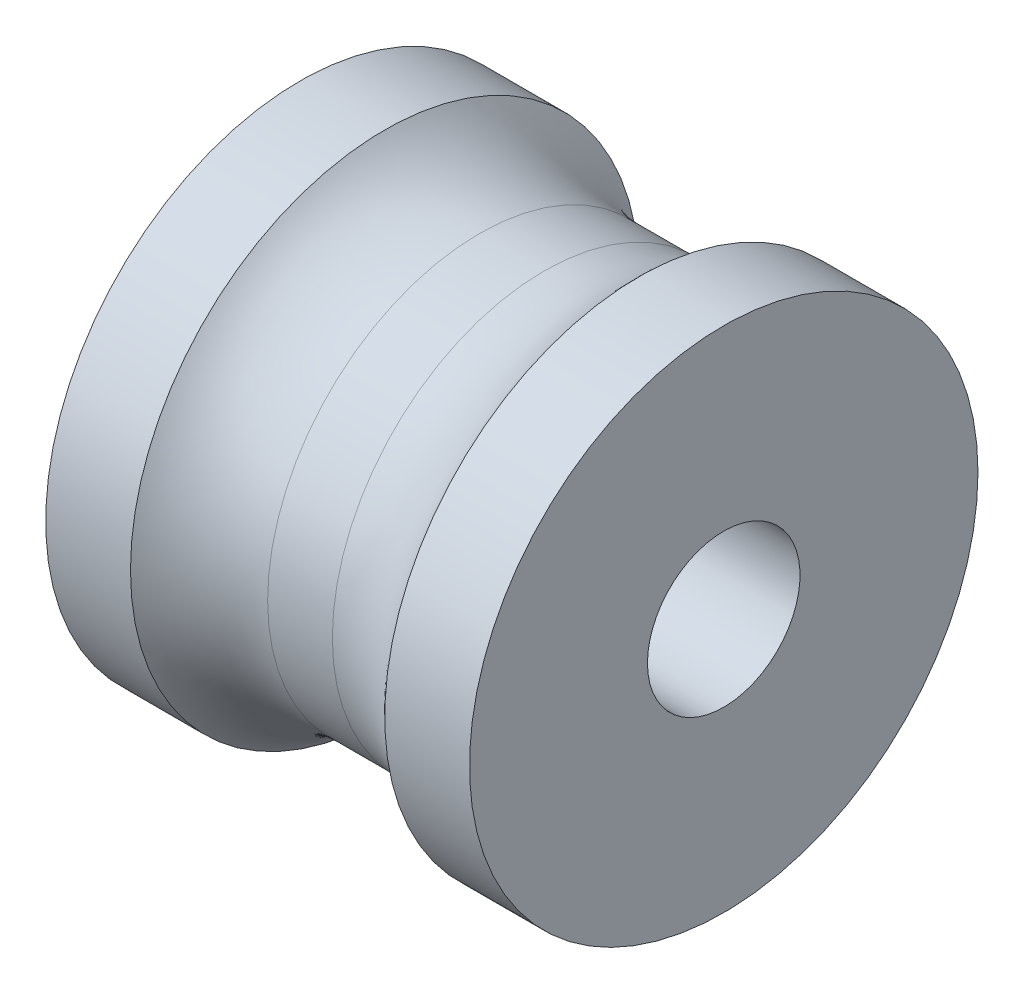
ISO-10303-21;
HEADER;
FILE_DESCRIPTION(('STEP AP214'),'2;1');
FILE_NAME('part.step','',(''),(''),'','','');
FILE_SCHEMA(('AUTOMOTIVE_DESIGN { 1 0 10303 214 1 1 1 1 }'));
ENDSEC;
DATA;
#1=APPLICATION_CONTEXT('core data for automotive mechanical design processes');
#2=APPLICATION_PROTOCOL_DEFINITION('international standard','automotive_design',2000,#1);
#3=PRODUCT_CONTEXT('',#1,'mechanical');
#4=PRODUCT('Part','Part','',(#3));
#5=PRODUCT_RELATED_PRODUCT_CATEGORY('part','',(#4));
#6=PRODUCT_DEFINITION_FORMATION('','',#4);
#7=PRODUCT_DEFINITION_CONTEXT('part definition',#1,'design');
#8=PRODUCT_DEFINITION('design','',#6,#7);
#9=PRODUCT_DEFINITION_SHAPE('','',#8);
#10=(LENGTH_UNIT() NAMED_UNIT(*) SI_UNIT(.MILLI.,.METRE.));
#11=(NAMED_UNIT(*) PLANE_ANGLE_UNIT() SI_UNIT($,.RADIAN.));
#12=(NAMED_UNIT(*) SI_UNIT($,.STERADIAN.) SOLID_ANGLE_UNIT());
#13=UNCERTAINTY_MEASURE_WITH_UNIT(LENGTH_MEASURE(1.E-05),#10,'distance_accuracy_value','');
#14=(GEOMETRIC_REPRESENTATION_CONTEXT(3) GLOBAL_UNCERTAINTY_ASSIGNED_CONTEXT((#13)) GLOBAL_UNIT_ASSIGNED_CONTEXT((#10,
#11,#12)) REPRESENTATION_CONTEXT('',''));
#15=CARTESIAN_POINT('',(0.,0.,0.));
#16=DIRECTION('',(0.,0.,1.));
#17=DIRECTION('',(1.,0.,0.));
#18=AXIS2_PLACEMENT_3D('',#15,#16,#17);
#19=CARTESIAN_POINT('',(2.,0.,0.));
#20=DIRECTION('',(-1.,0.,0.));
#21=DIRECTION('',(0.,0.,1.));
#22=AXIS2_PLACEMENT_3D('',#19,#20,#21);
#23=CYLINDRICAL_SURFACE('',#22,6.);
#24=CARTESIAN_POINT('',(2.,0.,0.));
#25=DIRECTION('',(1.,0.,0.));
#26=DIRECTION('',(0.,0.,-1.));
#27=AXIS2_PLACEMENT_3D('',#24,#25,#26);
#28=CIRCLE('',#27,6.);
#29=CARTESIAN_POINT('',(2.,0.,-6.));
#30=VERTEX_POINT('',#29);
#31=EDGE_CURVE('E42',#30,#30,#28,.T.);
#32=ORIENTED_EDGE('',*,*,#31,.F.);
#33=EDGE_LOOP('',(#32));
#34=FACE_BOUND('',#33,.T.);
#35=CARTESIAN_POINT('',(0.,0.,0.));
#36=DIRECTION('',(1.,0.,0.));
#37=DIRECTION('',(0.,0.,-1.));
#38=AXIS2_PLACEMENT_3D('',#35,#36,#37);
#39=CIRCLE('',#38,6.);
#40=CARTESIAN_POINT('',(0.,0.,-6.));
#41=VERTEX_POINT('',#40);
#42=EDGE_CURVE('E46',#41,#41,#39,.T.);
#43=ORIENTED_EDGE('',*,*,#42,.T.);
#44=EDGE_LOOP('',(#43));
#45=FACE_BOUND('',#44,.T.);
#46=ADVANCED_FACE('F31',(#34,#45),#23,.T.);
#47=CARTESIAN_POINT('',(0.,0.,0.));
#48=DIRECTION('',(1.,0.,0.));
#49=DIRECTION('',(0.,0.,-1.));
#50=AXIS2_PLACEMENT_3D('',#47,#48,#49);
#51=PLANE('',#50);
#52=CARTESIAN_POINT('',(0.,0.,0.));
#53=DIRECTION('',(-1.,0.,0.));
#54=DIRECTION('',(0.,0.,1.));
#55=AXIS2_PLACEMENT_3D('',#52,#53,#54);
#56=CIRCLE('',#55,1.8);
#57=CARTESIAN_POINT('',(0.,0.,1.8));
#58=VERTEX_POINT('',#57);
#59=EDGE_CURVE('E58',#58,#58,#56,.T.);
#60=ORIENTED_EDGE('',*,*,#59,.F.);
#61=EDGE_LOOP('',(#60));
#62=FACE_BOUND('',#61,.T.);
#63=ORIENTED_EDGE('',*,*,#42,.F.);
#64=EDGE_LOOP('',(#63));
#65=FACE_BOUND('',#64,.T.);
#66=ADVANCED_FACE('F73',(#62,#65),#51,.F.);
#67=CARTESIAN_POINT('',(8.,0.,0.));
#68=DIRECTION('',(-1.,0.,0.));
#69=DIRECTION('',(0.,0.,1.));
#70=AXIS2_PLACEMENT_3D('',#67,#68,#69);
#71=CYLINDRICAL_SURFACE('',#70,5.);
#72=CARTESIAN_POINT('',(5.76393202250021,0.,0.));
#73=DIRECTION('',(1.,0.,0.));
#74=DIRECTION('',(0.,0.,-1.));
#75=AXIS2_PLACEMENT_3D('',#72,#73,#74);
#76=CIRCLE('',#75,5.);
#77=CARTESIAN_POINT('',(5.76393202250021,0.,-5.));
#78=VERTEX_POINT('',#77);
#79=EDGE_CURVE('E10',#78,#78,#76,.F.);
#80=ORIENTED_EDGE('',*,*,#79,.T.);
#81=EDGE_LOOP('',(#80));
#82=FACE_BOUND('',#81,.T.);
#83=CARTESIAN_POINT('',(4.23606797749979,0.,0.));
#84=DIRECTION('',(-1.,0.,0.));
#85=DIRECTION('',(0.,0.,1.));
#86=AXIS2_PLACEMENT_3D('',#83,#84,#85);
#87=CIRCLE('',#86,5.);
#88=CARTESIAN_POINT('',(4.23606797749979,0.,5.));
#89=VERTEX_POINT('',#88);
#90=EDGE_CURVE('E38',#89,#89,#87,.F.);
#91=ORIENTED_EDGE('',*,*,#90,.T.);
#92=EDGE_LOOP('',(#91));
#93=FACE_BOUND('',#92,.T.);
#94=ADVANCED_FACE('F76',(#82,#93),#71,.T.);
#95=CARTESIAN_POINT('',(10.,0.,0.));
#96=DIRECTION('',(-1.,0.,0.));
#97=DIRECTION('',(0.,0.,1.));
#98=AXIS2_PLACEMENT_3D('',#95,#96,#97);
#99=CYLINDRICAL_SURFACE('',#98,6.);
#100=CARTESIAN_POINT('',(10.,0.,0.));
#101=DIRECTION('',(1.,0.,0.));
#102=DIRECTION('',(0.,0.,-1.));
#103=AXIS2_PLACEMENT_3D('',#100,#101,#102);
#104=CIRCLE('',#103,6.);
#105=CARTESIAN_POINT('',(10.,0.,-6.));
#106=VERTEX_POINT('',#105);
#107=EDGE_CURVE('E50',#106,#106,#104,.T.);
#108=ORIENTED_EDGE('',*,*,#107,.F.);
#109=EDGE_LOOP('',(#108));
#110=FACE_BOUND('',#109,.T.);
#111=CARTESIAN_POINT('',(8.,0.,0.));
#112=DIRECTION('',(1.,0.,0.));
#113=DIRECTION('',(0.,0.,-1.));
#114=AXIS2_PLACEMENT_3D('',#111,#112,#113);
#115=CIRCLE('',#114,6.);
#116=CARTESIAN_POINT('',(8.,0.,-6.));
#117=VERTEX_POINT('',#116);
#118=EDGE_CURVE('E52',#117,#117,#115,.T.);
#119=ORIENTED_EDGE('',*,*,#118,.T.);
#120=EDGE_LOOP('',(#119));
#121=FACE_BOUND('',#120,.T.);
#122=ADVANCED_FACE('F95',(#110,#121),#99,.T.);
#123=CARTESIAN_POINT('',(10.,0.,0.));
#124=DIRECTION('',(1.,0.,0.));
#125=DIRECTION('',(0.,0.,-1.));
#126=AXIS2_PLACEMENT_3D('',#123,#124,#125);
#127=PLANE('',#126);
#128=CARTESIAN_POINT('',(10.,0.,0.));
#129=DIRECTION('',(-1.,0.,0.));
#130=DIRECTION('',(0.,0.,1.));
#131=AXIS2_PLACEMENT_3D('',#128,#129,#130);
#132=CIRCLE('',#131,1.8);
#133=CARTESIAN_POINT('',(10.,0.,1.8));
#134=VERTEX_POINT('',#133);
#135=EDGE_CURVE('E55',#134,#134,#132,.T.);
#136=ORIENTED_EDGE('',*,*,#135,.T.);
#137=EDGE_LOOP('',(#136));
#138=FACE_BOUND('',#137,.T.);
#139=ORIENTED_EDGE('',*,*,#107,.T.);
#140=EDGE_LOOP('',(#139));
#141=FACE_BOUND('',#140,.T.);
#142=ADVANCED_FACE('F64',(#138,#141),#127,.T.);
#143=CARTESIAN_POINT('',(5.76393202250021,0.,0.));
#144=DIRECTION('',(1.,0.,0.));
#145=DIRECTION('',(0.,0.,-1.));
#146=AXIS2_PLACEMENT_3D('',#143,#144,#145);
#147=TOROIDAL_SURFACE('',#146,8.,3.);
#148=ORIENTED_EDGE('',*,*,#79,.F.);
#149=EDGE_LOOP('',(#148));
#150=FACE_BOUND('',#149,.T.);
#151=ORIENTED_EDGE('',*,*,#118,.F.);
#152=EDGE_LOOP('',(#151));
#153=FACE_BOUND('',#152,.T.);
#154=ADVANCED_FACE('F87',(#150,#153),#147,.F.);
#155=CARTESIAN_POINT('',(4.23606797749979,0.,0.));
#156=DIRECTION('',(-1.,0.,0.));
#157=DIRECTION('',(0.,0.,1.));
#158=AXIS2_PLACEMENT_3D('',#155,#156,#157);
#159=TOROIDAL_SURFACE('',#158,8.,3.);
#160=ORIENTED_EDGE('',*,*,#31,.T.);
#161=EDGE_LOOP('',(#160));
#162=FACE_BOUND('',#161,.T.);
#163=ORIENTED_EDGE('',*,*,#90,.F.);
#164=EDGE_LOOP('',(#163));
#165=FACE_BOUND('',#164,.T.);
#166=ADVANCED_FACE('F33',(#162,#165),#159,.F.);
#167=CARTESIAN_POINT('',(10.,0.,0.));
#168=DIRECTION('',(-1.,0.,0.));
#169=DIRECTION('',(0.,0.,1.));
#170=AXIS2_PLACEMENT_3D('',#167,#168,#169);
#171=CYLINDRICAL_SURFACE('',#170,1.8);
#172=ORIENTED_EDGE('',*,*,#135,.F.);
#173=EDGE_LOOP('',(#172));
#174=FACE_BOUND('',#173,.T.);
#175=ORIENTED_EDGE('',*,*,#59,.T.);
#176=EDGE_LOOP('',(#175));
#177=FACE_BOUND('',#176,.T.);
#178=ADVANCED_FACE('F67',(#174,#177),#171,.F.);
#179=CLOSED_SHELL('',(#46,#66,#94,#122,#142,#154,#166,#178));
#180=MANIFOLD_SOLID_BREP('B2',#179);
#181=ADVANCED_BREP_SHAPE_REPRESENTATION('',(#18,#180),#14);
#182=SHAPE_DEFINITION_REPRESENTATION(#9,#181);
ENDSEC;
END-ISO-10303-21;
